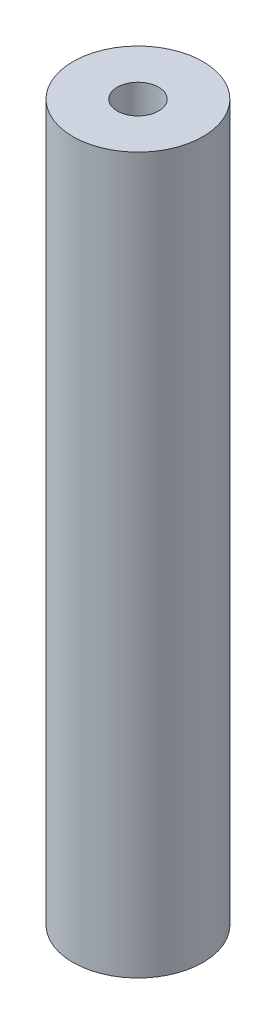
ISO-10303-21;
HEADER;
FILE_DESCRIPTION(('STEP AP214'),'2;1');
FILE_NAME('part.step','',(''),(''),'','','');
FILE_SCHEMA(('AUTOMOTIVE_DESIGN { 1 0 10303 214 1 1 1 1 }'));
ENDSEC;
DATA;
#1=APPLICATION_CONTEXT('core data for automotive mechanical design processes');
#2=APPLICATION_PROTOCOL_DEFINITION('international standard','automotive_design',2000,#1);
#3=PRODUCT_CONTEXT('',#1,'mechanical');
#4=PRODUCT('Part','Part','',(#3));
#5=PRODUCT_RELATED_PRODUCT_CATEGORY('part','',(#4));
#6=PRODUCT_DEFINITION_FORMATION('','',#4);
#7=PRODUCT_DEFINITION_CONTEXT('part definition',#1,'design');
#8=PRODUCT_DEFINITION('design','',#6,#7);
#9=PRODUCT_DEFINITION_SHAPE('','',#8);
#10=(LENGTH_UNIT() NAMED_UNIT(*) SI_UNIT(.MILLI.,.METRE.));
#11=(NAMED_UNIT(*) PLANE_ANGLE_UNIT() SI_UNIT($,.RADIAN.));
#12=(NAMED_UNIT(*) SI_UNIT($,.STERADIAN.) SOLID_ANGLE_UNIT());
#13=UNCERTAINTY_MEASURE_WITH_UNIT(LENGTH_MEASURE(1.E-05),#10,'distance_accuracy_value','');
#14=(GEOMETRIC_REPRESENTATION_CONTEXT(3) GLOBAL_UNCERTAINTY_ASSIGNED_CONTEXT((#13)) GLOBAL_UNIT_ASSIGNED_CONTEXT((#10,
#11,#12)) REPRESENTATION_CONTEXT('',''));
#15=CARTESIAN_POINT('',(0.,0.,0.));
#16=DIRECTION('',(0.,0.,1.));
#17=DIRECTION('',(1.,0.,0.));
#18=AXIS2_PLACEMENT_3D('',#15,#16,#17);
#19=CARTESIAN_POINT('',(0.,69.85,0.));
#20=DIRECTION('',(0.,1.,0.));
#21=DIRECTION('',(0.,0.,1.));
#22=AXIS2_PLACEMENT_3D('',#19,#20,#21);
#23=PLANE('',#22);
#24=CARTESIAN_POINT('',(0.,69.85,0.));
#25=DIRECTION('',(0.,1.,0.));
#26=DIRECTION('',(0.,0.,1.));
#27=AXIS2_PLACEMENT_3D('',#24,#25,#26);
#28=CIRCLE('',#27,6.35);
#29=CARTESIAN_POINT('',(0.,69.85,6.35));
#30=VERTEX_POINT('',#29);
#31=EDGE_CURVE('E10',#30,#30,#28,.T.);
#32=ORIENTED_EDGE('',*,*,#31,.T.);
#33=EDGE_LOOP('',(#32));
#34=FACE_BOUND('',#33,.T.);
#35=CARTESIAN_POINT('',(0.,69.85,0.));
#36=DIRECTION('',(0.,1.,0.));
#37=DIRECTION('',(0.,0.,1.));
#38=AXIS2_PLACEMENT_3D('',#35,#36,#37);
#39=CIRCLE('',#38,2.0193);
#40=CARTESIAN_POINT('',(0.,69.85,2.0193));
#41=VERTEX_POINT('',#40);
#42=EDGE_CURVE('E42',#41,#41,#39,.T.);
#43=ORIENTED_EDGE('',*,*,#42,.F.);
#44=EDGE_LOOP('',(#43));
#45=FACE_BOUND('',#44,.T.);
#46=ADVANCED_FACE('F31',(#34,#45),#23,.T.);
#47=CARTESIAN_POINT('',(0.,0.,0.));
#48=DIRECTION('',(0.,1.,0.));
#49=DIRECTION('',(0.,0.,1.));
#50=AXIS2_PLACEMENT_3D('',#47,#48,#49);
#51=PLANE('',#50);
#52=CARTESIAN_POINT('',(0.,0.,0.));
#53=DIRECTION('',(0.,1.,0.));
#54=DIRECTION('',(0.,0.,1.));
#55=AXIS2_PLACEMENT_3D('',#52,#53,#54);
#56=CIRCLE('',#55,6.35);
#57=CARTESIAN_POINT('',(0.,0.,6.35));
#58=VERTEX_POINT('',#57);
#59=EDGE_CURVE('E35',#58,#58,#56,.T.);
#60=ORIENTED_EDGE('',*,*,#59,.F.);
#61=EDGE_LOOP('',(#60));
#62=FACE_BOUND('',#61,.T.);
#63=CARTESIAN_POINT('',(0.,0.,0.));
#64=DIRECTION('',(0.,1.,0.));
#65=DIRECTION('',(0.,0.,1.));
#66=AXIS2_PLACEMENT_3D('',#63,#64,#65);
#67=CIRCLE('',#66,2.0193);
#68=CARTESIAN_POINT('',(0.,0.,2.0193));
#69=VERTEX_POINT('',#68);
#70=EDGE_CURVE('E44',#69,#69,#67,.T.);
#71=ORIENTED_EDGE('',*,*,#70,.T.);
#72=EDGE_LOOP('',(#71));
#73=FACE_BOUND('',#72,.T.);
#74=ADVANCED_FACE('F54',(#62,#73),#51,.F.);
#75=CARTESIAN_POINT('',(0.,69.85,0.));
#76=DIRECTION('',(0.,-1.,0.));
#77=DIRECTION('',(0.,0.,-1.));
#78=AXIS2_PLACEMENT_3D('',#75,#76,#77);
#79=CYLINDRICAL_SURFACE('',#78,6.35);
#80=ORIENTED_EDGE('',*,*,#31,.F.);
#81=EDGE_LOOP('',(#80));
#82=FACE_BOUND('',#81,.T.);
#83=ORIENTED_EDGE('',*,*,#59,.T.);
#84=EDGE_LOOP('',(#83));
#85=FACE_BOUND('',#84,.T.);
#86=ADVANCED_FACE('F33',(#82,#85),#79,.T.);
#87=CARTESIAN_POINT('',(0.,69.85,0.));
#88=DIRECTION('',(0.,-1.,0.));
#89=DIRECTION('',(0.,0.,-1.));
#90=AXIS2_PLACEMENT_3D('',#87,#88,#89);
#91=CYLINDRICAL_SURFACE('',#90,2.0193);
#92=ORIENTED_EDGE('',*,*,#42,.T.);
#93=EDGE_LOOP('',(#92));
#94=FACE_BOUND('',#93,.T.);
#95=ORIENTED_EDGE('',*,*,#70,.F.);
#96=EDGE_LOOP('',(#95));
#97=FACE_BOUND('',#96,.T.);
#98=ADVANCED_FACE('F50',(#94,#97),#91,.F.);
#99=CLOSED_SHELL('',(#46,#74,#86,#98));
#100=MANIFOLD_SOLID_BREP('B2',#99);
#101=ADVANCED_BREP_SHAPE_REPRESENTATION('',(#18,#100),#14);
#102=SHAPE_DEFINITION_REPRESENTATION(#9,#101);
ENDSEC;
END-ISO-10303-21;
